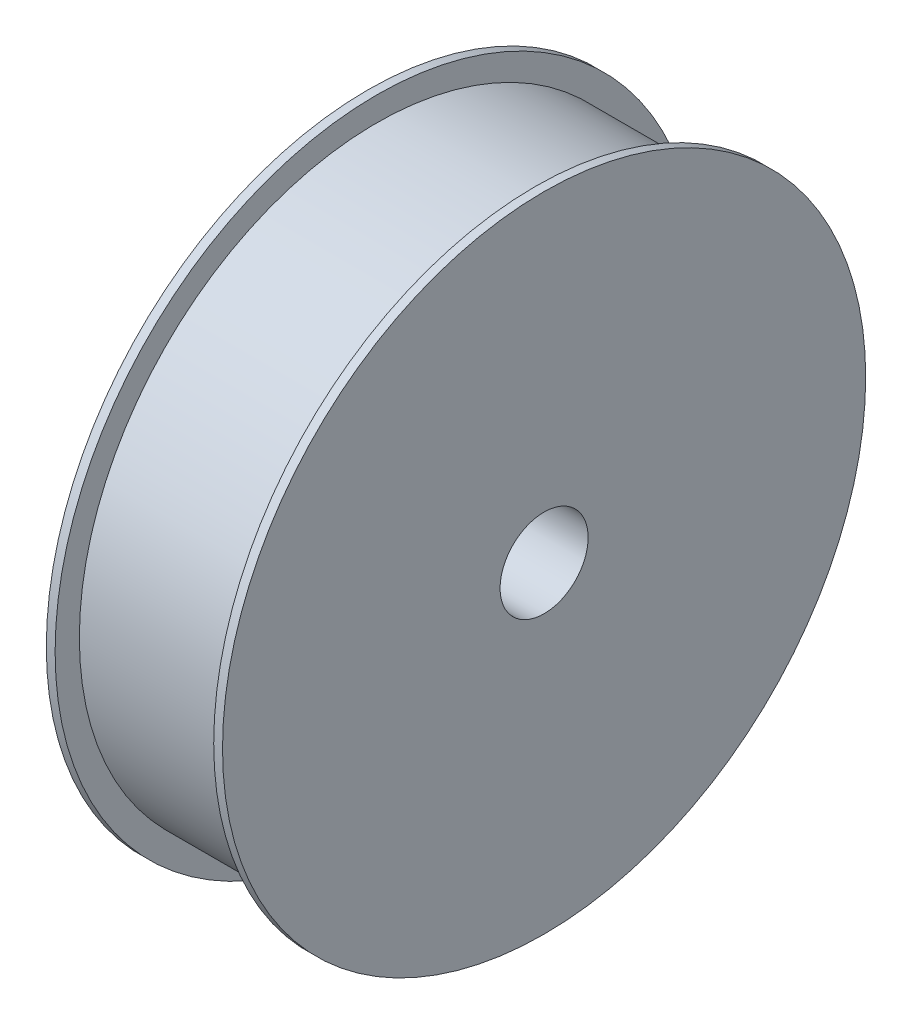
ISO-10303-21;
HEADER;
FILE_DESCRIPTION(('STEP AP214'),'2;1');
FILE_NAME('part.step','',(''),(''),'','','');
FILE_SCHEMA(('AUTOMOTIVE_DESIGN { 1 0 10303 214 1 1 1 1 }'));
ENDSEC;
DATA;
#1=APPLICATION_CONTEXT('core data for automotive mechanical design processes');
#2=APPLICATION_PROTOCOL_DEFINITION('international standard','automotive_design',2000,#1);
#3=PRODUCT_CONTEXT('',#1,'mechanical');
#4=PRODUCT('Part','Part','',(#3));
#5=PRODUCT_RELATED_PRODUCT_CATEGORY('part','',(#4));
#6=PRODUCT_DEFINITION_FORMATION('','',#4);
#7=PRODUCT_DEFINITION_CONTEXT('part definition',#1,'design');
#8=PRODUCT_DEFINITION('design','',#6,#7);
#9=PRODUCT_DEFINITION_SHAPE('','',#8);
#10=(LENGTH_UNIT() NAMED_UNIT(*) SI_UNIT(.MILLI.,.METRE.));
#11=(NAMED_UNIT(*) PLANE_ANGLE_UNIT() SI_UNIT($,.RADIAN.));
#12=(NAMED_UNIT(*) SI_UNIT($,.STERADIAN.) SOLID_ANGLE_UNIT());
#13=UNCERTAINTY_MEASURE_WITH_UNIT(LENGTH_MEASURE(1.E-05),#10,'distance_accuracy_value','');
#14=(GEOMETRIC_REPRESENTATION_CONTEXT(3) GLOBAL_UNCERTAINTY_ASSIGNED_CONTEXT((#13)) GLOBAL_UNIT_ASSIGNED_CONTEXT((#10,
#11,#12)) REPRESENTATION_CONTEXT('',''));
#15=CARTESIAN_POINT('',(0.,0.,0.));
#16=DIRECTION('',(0.,0.,1.));
#17=DIRECTION('',(1.,0.,0.));
#18=AXIS2_PLACEMENT_3D('',#15,#16,#17);
#19=CARTESIAN_POINT('',(37.9307643122682,5.,0.));
#20=DIRECTION('',(1.,0.,0.));
#21=DIRECTION('',(0.,0.,-1.));
#22=AXIS2_PLACEMENT_3D('',#19,#20,#21);
#23=PLANE('',#22);
#24=CARTESIAN_POINT('',(37.9307643122682,0.,0.));
#25=DIRECTION('',(-1.,0.,0.));
#26=DIRECTION('',(0.,0.,1.));
#27=AXIS2_PLACEMENT_3D('',#24,#25,#26);
#28=CIRCLE('',#27,5.);
#29=CARTESIAN_POINT('',(37.9307643122682,0.,5.));
#30=VERTEX_POINT('',#29);
#31=EDGE_CURVE('E10',#30,#30,#28,.T.);
#32=ORIENTED_EDGE('',*,*,#31,.F.);
#33=EDGE_LOOP('',(#32));
#34=FACE_BOUND('',#33,.T.);
#35=CARTESIAN_POINT('',(37.9307643122682,0.,0.));
#36=DIRECTION('',(-1.,0.,0.));
#37=DIRECTION('',(0.,0.,1.));
#38=AXIS2_PLACEMENT_3D('',#35,#36,#37);
#39=CIRCLE('',#38,25.);
#40=CARTESIAN_POINT('',(37.9307643122682,0.,25.));
#41=VERTEX_POINT('',#40);
#42=EDGE_CURVE('E82',#41,#41,#39,.T.);
#43=ORIENTED_EDGE('',*,*,#42,.T.);
#44=EDGE_LOOP('',(#43));
#45=FACE_BOUND('',#44,.T.);
#46=ADVANCED_FACE('F39',(#34,#45),#23,.F.);
#47=CARTESIAN_POINT('',(-58.1666151501891,0.,0.));
#48=DIRECTION('',(-1.,0.,0.));
#49=DIRECTION('',(0.,0.,1.));
#50=AXIS2_PLACEMENT_3D('',#47,#48,#49);
#51=CYLINDRICAL_SURFACE('',#50,5.);
#52=CARTESIAN_POINT('',(64.9307643122682,0.,0.));
#53=DIRECTION('',(-1.,0.,0.));
#54=DIRECTION('',(0.,0.,1.));
#55=AXIS2_PLACEMENT_3D('',#52,#53,#54);
#56=CIRCLE('',#55,5.);
#57=CARTESIAN_POINT('',(64.9307643122682,0.,5.));
#58=VERTEX_POINT('',#57);
#59=EDGE_CURVE('E46',#58,#58,#56,.T.);
#60=ORIENTED_EDGE('',*,*,#59,.F.);
#61=EDGE_LOOP('',(#60));
#62=FACE_BOUND('',#61,.T.);
#63=ORIENTED_EDGE('',*,*,#31,.T.);
#64=EDGE_LOOP('',(#63));
#65=FACE_BOUND('',#64,.T.);
#66=ADVANCED_FACE('F132',(#62,#65),#51,.F.);
#67=CARTESIAN_POINT('',(64.9307643122682,36.5,0.));
#68=DIRECTION('',(-1.,0.,0.));
#69=DIRECTION('',(0.,0.,1.));
#70=AXIS2_PLACEMENT_3D('',#67,#68,#69);
#71=PLANE('',#70);
#72=CARTESIAN_POINT('',(64.9307643122682,0.,0.));
#73=DIRECTION('',(-1.,0.,0.));
#74=DIRECTION('',(0.,0.,1.));
#75=AXIS2_PLACEMENT_3D('',#72,#73,#74);
#76=CIRCLE('',#75,36.5);
#77=CARTESIAN_POINT('',(64.9307643122682,0.,36.5));
#78=VERTEX_POINT('',#77);
#79=EDGE_CURVE('E51',#78,#78,#76,.T.);
#80=ORIENTED_EDGE('',*,*,#79,.F.);
#81=EDGE_LOOP('',(#80));
#82=FACE_BOUND('',#81,.T.);
#83=ORIENTED_EDGE('',*,*,#59,.T.);
#84=EDGE_LOOP('',(#83));
#85=FACE_BOUND('',#84,.T.);
#86=ADVANCED_FACE('F127',(#82,#85),#71,.F.);
#87=CARTESIAN_POINT('',(-58.1666151501891,0.,0.));
#88=DIRECTION('',(-1.,0.,0.));
#89=DIRECTION('',(0.,0.,1.));
#90=AXIS2_PLACEMENT_3D('',#87,#88,#89);
#91=CYLINDRICAL_SURFACE('',#90,36.5);
#92=CARTESIAN_POINT('',(63.9307643122682,0.,0.));
#93=DIRECTION('',(-1.,0.,0.));
#94=DIRECTION('',(0.,0.,1.));
#95=AXIS2_PLACEMENT_3D('',#92,#93,#94);
#96=CIRCLE('',#95,36.5);
#97=CARTESIAN_POINT('',(63.9307643122682,0.,36.5));
#98=VERTEX_POINT('',#97);
#99=EDGE_CURVE('E56',#98,#98,#96,.T.);
#100=ORIENTED_EDGE('',*,*,#99,.F.);
#101=EDGE_LOOP('',(#100));
#102=FACE_BOUND('',#101,.T.);
#103=ORIENTED_EDGE('',*,*,#79,.T.);
#104=EDGE_LOOP('',(#103));
#105=FACE_BOUND('',#104,.T.);
#106=ADVANCED_FACE('F121',(#102,#105),#91,.T.);
#107=CARTESIAN_POINT('',(63.9307643122682,36.5,0.));
#108=DIRECTION('',(1.,0.,0.));
#109=DIRECTION('',(0.,0.,-1.));
#110=AXIS2_PLACEMENT_3D('',#107,#108,#109);
#111=PLANE('',#110);
#112=CARTESIAN_POINT('',(63.9307643122682,0.,0.));
#113=DIRECTION('',(-1.,0.,0.));
#114=DIRECTION('',(0.,0.,1.));
#115=AXIS2_PLACEMENT_3D('',#112,#113,#114);
#116=CIRCLE('',#115,33.75);
#117=CARTESIAN_POINT('',(63.9307643122682,0.,33.75));
#118=VERTEX_POINT('',#117);
#119=EDGE_CURVE('E62',#118,#118,#116,.T.);
#120=ORIENTED_EDGE('',*,*,#119,.F.);
#121=EDGE_LOOP('',(#120));
#122=FACE_BOUND('',#121,.T.);
#123=ORIENTED_EDGE('',*,*,#99,.T.);
#124=EDGE_LOOP('',(#123));
#125=FACE_BOUND('',#124,.T.);
#126=ADVANCED_FACE('F115',(#122,#125),#111,.F.);
#127=CARTESIAN_POINT('',(-58.1666151501891,0.,0.));
#128=DIRECTION('',(-1.,0.,0.));
#129=DIRECTION('',(0.,0.,1.));
#130=AXIS2_PLACEMENT_3D('',#127,#128,#129);
#131=CYLINDRICAL_SURFACE('',#130,33.75);
#132=CARTESIAN_POINT('',(45.9307643122682,0.,0.));
#133=DIRECTION('',(-1.,0.,0.));
#134=DIRECTION('',(0.,0.,1.));
#135=AXIS2_PLACEMENT_3D('',#132,#133,#134);
#136=CIRCLE('',#135,33.75);
#137=CARTESIAN_POINT('',(45.9307643122682,0.,33.75));
#138=VERTEX_POINT('',#137);
#139=EDGE_CURVE('E66',#138,#138,#136,.T.);
#140=ORIENTED_EDGE('',*,*,#139,.F.);
#141=EDGE_LOOP('',(#140));
#142=FACE_BOUND('',#141,.T.);
#143=ORIENTED_EDGE('',*,*,#119,.T.);
#144=EDGE_LOOP('',(#143));
#145=FACE_BOUND('',#144,.T.);
#146=ADVANCED_FACE('F109',(#142,#145),#131,.T.);
#147=CARTESIAN_POINT('',(45.9307643122682,33.75,0.));
#148=DIRECTION('',(-1.,0.,0.));
#149=DIRECTION('',(0.,0.,1.));
#150=AXIS2_PLACEMENT_3D('',#147,#148,#149);
#151=PLANE('',#150);
#152=CARTESIAN_POINT('',(45.9307643122682,0.,0.));
#153=DIRECTION('',(-1.,0.,0.));
#154=DIRECTION('',(0.,0.,1.));
#155=AXIS2_PLACEMENT_3D('',#152,#153,#154);
#156=CIRCLE('',#155,36.5);
#157=CARTESIAN_POINT('',(45.9307643122682,0.,36.5));
#158=VERTEX_POINT('',#157);
#159=EDGE_CURVE('E70',#158,#158,#156,.T.);
#160=ORIENTED_EDGE('',*,*,#159,.F.);
#161=EDGE_LOOP('',(#160));
#162=FACE_BOUND('',#161,.T.);
#163=ORIENTED_EDGE('',*,*,#139,.T.);
#164=EDGE_LOOP('',(#163));
#165=FACE_BOUND('',#164,.T.);
#166=ADVANCED_FACE('F103',(#162,#165),#151,.F.);
#167=CARTESIAN_POINT('',(-58.1666151501891,0.,0.));
#168=DIRECTION('',(-1.,0.,0.));
#169=DIRECTION('',(0.,0.,1.));
#170=AXIS2_PLACEMENT_3D('',#167,#168,#169);
#171=CYLINDRICAL_SURFACE('',#170,36.5);
#172=CARTESIAN_POINT('',(44.9307643122682,0.,0.));
#173=DIRECTION('',(-1.,0.,0.));
#174=DIRECTION('',(0.,0.,1.));
#175=AXIS2_PLACEMENT_3D('',#172,#173,#174);
#176=CIRCLE('',#175,36.5);
#177=CARTESIAN_POINT('',(44.9307643122682,0.,36.5));
#178=VERTEX_POINT('',#177);
#179=EDGE_CURVE('E74',#178,#178,#176,.T.);
#180=ORIENTED_EDGE('',*,*,#179,.F.);
#181=EDGE_LOOP('',(#180));
#182=FACE_BOUND('',#181,.T.);
#183=ORIENTED_EDGE('',*,*,#159,.T.);
#184=EDGE_LOOP('',(#183));
#185=FACE_BOUND('',#184,.T.);
#186=ADVANCED_FACE('F97',(#182,#185),#171,.T.);
#187=CARTESIAN_POINT('',(44.9307643122682,29.0816703895743,0.));
#188=DIRECTION('',(1.,0.,0.));
#189=DIRECTION('',(0.,0.,-1.));
#190=AXIS2_PLACEMENT_3D('',#187,#188,#189);
#191=PLANE('',#190);
#192=CARTESIAN_POINT('',(44.9307643122682,0.,0.));
#193=DIRECTION('',(-1.,0.,0.));
#194=DIRECTION('',(0.,0.,1.));
#195=AXIS2_PLACEMENT_3D('',#192,#193,#194);
#196=CIRCLE('',#195,25.);
#197=CARTESIAN_POINT('',(44.9307643122682,0.,25.));
#198=VERTEX_POINT('',#197);
#199=EDGE_CURVE('E78',#198,#198,#196,.T.);
#200=ORIENTED_EDGE('',*,*,#199,.F.);
#201=EDGE_LOOP('',(#200));
#202=FACE_BOUND('',#201,.T.);
#203=ORIENTED_EDGE('',*,*,#179,.T.);
#204=EDGE_LOOP('',(#203));
#205=FACE_BOUND('',#204,.T.);
#206=ADVANCED_FACE('F91',(#202,#205),#191,.F.);
#207=CARTESIAN_POINT('',(-58.1666151501891,0.,0.));
#208=DIRECTION('',(-1.,0.,0.));
#209=DIRECTION('',(0.,0.,1.));
#210=AXIS2_PLACEMENT_3D('',#207,#208,#209);
#211=CYLINDRICAL_SURFACE('',#210,25.);
#212=ORIENTED_EDGE('',*,*,#42,.F.);
#213=EDGE_LOOP('',(#212));
#214=FACE_BOUND('',#213,.T.);
#215=ORIENTED_EDGE('',*,*,#199,.T.);
#216=EDGE_LOOP('',(#215));
#217=FACE_BOUND('',#216,.T.);
#218=ADVANCED_FACE('F88',(#214,#217),#211,.T.);
#219=CLOSED_SHELL('',(#46,#66,#86,#106,#126,#146,#166,#186,#206,#218));
#220=MANIFOLD_SOLID_BREP('B2',#219);
#221=ADVANCED_BREP_SHAPE_REPRESENTATION('',(#18,#220),#14);
#222=SHAPE_DEFINITION_REPRESENTATION(#9,#221);
ENDSEC;
END-ISO-10303-21;
